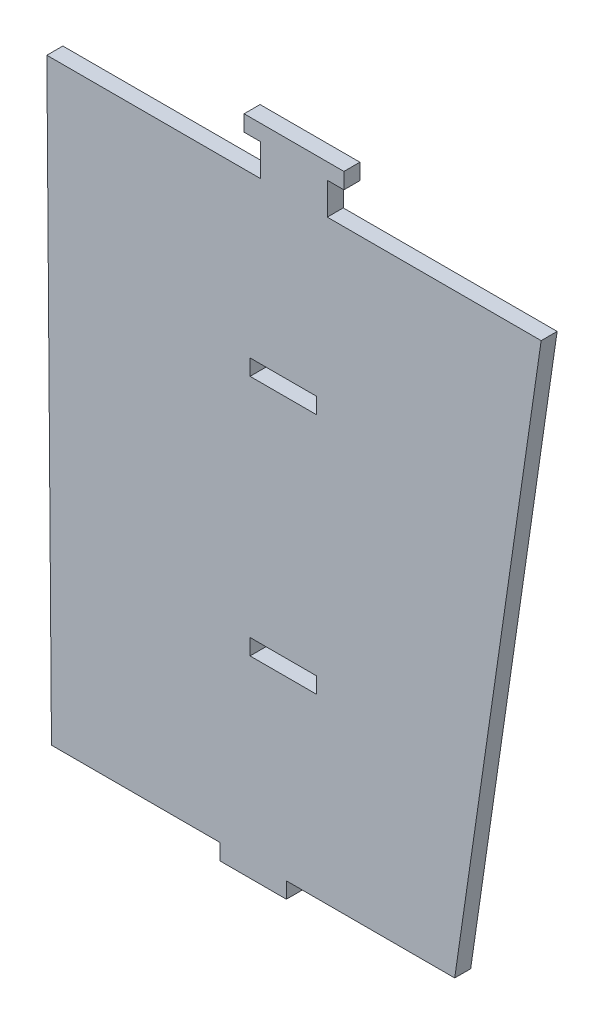
ISO-10303-21;
HEADER;
FILE_DESCRIPTION(('STEP AP214'),'2;1');
FILE_NAME('part.step','',(''),(''),'','','');
FILE_SCHEMA(('AUTOMOTIVE_DESIGN { 1 0 10303 214 1 1 1 1 }'));
ENDSEC;
DATA;
#1=APPLICATION_CONTEXT('core data for automotive mechanical design processes');
#2=APPLICATION_PROTOCOL_DEFINITION('international standard','automotive_design',2000,#1);
#3=PRODUCT_CONTEXT('',#1,'mechanical');
#4=PRODUCT('Part','Part','',(#3));
#5=PRODUCT_RELATED_PRODUCT_CATEGORY('part','',(#4));
#6=PRODUCT_DEFINITION_FORMATION('','',#4);
#7=PRODUCT_DEFINITION_CONTEXT('part definition',#1,'design');
#8=PRODUCT_DEFINITION('design','',#6,#7);
#9=PRODUCT_DEFINITION_SHAPE('','',#8);
#10=(LENGTH_UNIT() NAMED_UNIT(*) SI_UNIT(.MILLI.,.METRE.));
#11=(NAMED_UNIT(*) PLANE_ANGLE_UNIT() SI_UNIT($,.RADIAN.));
#12=(NAMED_UNIT(*) SI_UNIT($,.STERADIAN.) SOLID_ANGLE_UNIT());
#13=UNCERTAINTY_MEASURE_WITH_UNIT(LENGTH_MEASURE(1.E-05),#10,'distance_accuracy_value','');
#14=(GEOMETRIC_REPRESENTATION_CONTEXT(3) GLOBAL_UNCERTAINTY_ASSIGNED_CONTEXT((#13)) GLOBAL_UNIT_ASSIGNED_CONTEXT((#10,
#11,#12)) REPRESENTATION_CONTEXT('',''));
#15=CARTESIAN_POINT('',(0.,0.,0.));
#16=DIRECTION('',(0.,0.,1.));
#17=DIRECTION('',(1.,0.,0.));
#18=AXIS2_PLACEMENT_3D('',#15,#16,#17);
#19=CARTESIAN_POINT('',(-122.883521437337,-1.524,1.524));
#20=DIRECTION('',(0.,-1.,0.));
#21=DIRECTION('',(0.,0.,-1.));
#22=AXIS2_PLACEMENT_3D('',#19,#20,#21);
#23=PLANE('',#22);
#24=DIRECTION('',(-1.,0.,0.));
#25=VECTOR('',#24,1.);
#26=CARTESIAN_POINT('',(-122.883521437337,-1.524,0.));
#27=LINE('',#26,#25);
#28=CARTESIAN_POINT('',(-102.477755774951,-1.524,0.));
#29=VERTEX_POINT('',#28);
#30=CARTESIAN_POINT('',(-122.883521437337,-1.524,0.));
#31=VERTEX_POINT('',#30);
#32=EDGE_CURVE('E260',#29,#31,#27,.T.);
#33=ORIENTED_EDGE('',*,*,#32,.T.);
#34=DIRECTION('',(0.,0.,-1.));
#35=VECTOR('',#34,1.);
#36=CARTESIAN_POINT('',(-122.883521437337,-1.524,1.524));
#37=LINE('',#36,#35);
#38=CARTESIAN_POINT('',(-122.883521437337,-1.524,1.524));
#39=VERTEX_POINT('',#38);
#40=EDGE_CURVE('E11',#39,#31,#37,.T.);
#41=ORIENTED_EDGE('',*,*,#40,.F.);
#42=DIRECTION('',(-1.,0.,0.));
#43=VECTOR('',#42,1.);
#44=CARTESIAN_POINT('',(-122.883521437337,-1.524,1.524));
#45=LINE('',#44,#43);
#46=CARTESIAN_POINT('',(-102.477755774951,-1.524,1.524));
#47=VERTEX_POINT('',#46);
#48=EDGE_CURVE('E267',#47,#39,#45,.T.);
#49=ORIENTED_EDGE('',*,*,#48,.F.);
#50=DIRECTION('',(0.,0.,-1.));
#51=VECTOR('',#50,1.);
#52=CARTESIAN_POINT('',(-102.477755774951,-1.524,1.524));
#53=LINE('',#52,#51);
#54=EDGE_CURVE('E301',#47,#29,#53,.T.);
#55=ORIENTED_EDGE('',*,*,#54,.T.);
#56=EDGE_LOOP('',(#33,#41,#49,#55));
#57=FACE_BOUND('',#56,.T.);
#58=ADVANCED_FACE('F38',(#57),#23,.F.);
#59=CARTESIAN_POINT('',(-122.883521437337,-1.524,1.524));
#60=DIRECTION('',(-1.,0.,0.));
#61=DIRECTION('',(0.,0.,1.));
#62=AXIS2_PLACEMENT_3D('',#59,#60,#61);
#63=PLANE('',#62);
#64=DIRECTION('',(0.,1.,0.));
#65=VECTOR('',#64,1.);
#66=CARTESIAN_POINT('',(-122.883521437337,-1.524,0.));
#67=LINE('',#66,#65);
#68=CARTESIAN_POINT('',(-122.883521437337,1.524,0.));
#69=VERTEX_POINT('',#68);
#70=EDGE_CURVE('E304',#31,#69,#67,.T.);
#71=ORIENTED_EDGE('',*,*,#70,.T.);
#72=DIRECTION('',(0.,0.,-1.));
#73=VECTOR('',#72,1.);
#74=CARTESIAN_POINT('',(-122.883521437337,1.524,1.524));
#75=LINE('',#74,#73);
#76=CARTESIAN_POINT('',(-122.883521437337,1.524,1.524));
#77=VERTEX_POINT('',#76);
#78=EDGE_CURVE('E45',#77,#69,#75,.T.);
#79=ORIENTED_EDGE('',*,*,#78,.F.);
#80=DIRECTION('',(0.,1.,0.));
#81=VECTOR('',#80,1.);
#82=CARTESIAN_POINT('',(-122.883521437337,-1.524,1.524));
#83=LINE('',#82,#81);
#84=EDGE_CURVE('E270',#39,#77,#83,.T.);
#85=ORIENTED_EDGE('',*,*,#84,.F.);
#86=ORIENTED_EDGE('',*,*,#40,.T.);
#87=EDGE_LOOP('',(#71,#79,#85,#86));
#88=FACE_BOUND('',#87,.T.);
#89=ADVANCED_FACE('F400',(#88),#63,.F.);
#90=CARTESIAN_POINT('',(-121.296021437337,1.524,1.524));
#91=DIRECTION('',(0.,1.,0.));
#92=DIRECTION('',(0.,0.,1.));
#93=AXIS2_PLACEMENT_3D('',#90,#91,#92);
#94=PLANE('',#93);
#95=DIRECTION('',(1.,0.,0.));
#96=VECTOR('',#95,1.);
#97=CARTESIAN_POINT('',(-121.296021437337,1.524,0.));
#98=LINE('',#97,#96);
#99=CARTESIAN_POINT('',(-121.296021437337,1.524,0.));
#100=VERTEX_POINT('',#99);
#101=EDGE_CURVE('E306',#69,#100,#98,.T.);
#102=ORIENTED_EDGE('',*,*,#101,.T.);
#103=DIRECTION('',(0.,0.,-1.));
#104=VECTOR('',#103,1.);
#105=CARTESIAN_POINT('',(-121.296021437337,1.524,1.524));
#106=LINE('',#105,#104);
#107=CARTESIAN_POINT('',(-121.296021437337,1.524,1.524));
#108=VERTEX_POINT('',#107);
#109=EDGE_CURVE('E371',#108,#100,#106,.T.);
#110=ORIENTED_EDGE('',*,*,#109,.F.);
#111=DIRECTION('',(1.,0.,0.));
#112=VECTOR('',#111,1.);
#113=CARTESIAN_POINT('',(-121.296021437337,1.524,1.524));
#114=LINE('',#113,#112);
#115=EDGE_CURVE('E273',#77,#108,#114,.T.);
#116=ORIENTED_EDGE('',*,*,#115,.F.);
#117=ORIENTED_EDGE('',*,*,#78,.T.);
#118=EDGE_LOOP('',(#102,#110,#116,#117));
#119=FACE_BOUND('',#118,.T.);
#120=ADVANCED_FACE('F378',(#119),#94,.F.);
#121=CARTESIAN_POINT('',(-121.296021437337,1.524,1.524));
#122=DIRECTION('',(-1.,0.,0.));
#123=DIRECTION('',(0.,0.,1.));
#124=AXIS2_PLACEMENT_3D('',#121,#122,#123);
#125=PLANE('',#124);
#126=DIRECTION('',(0.,1.,0.));
#127=VECTOR('',#126,1.);
#128=CARTESIAN_POINT('',(-121.296021437337,1.524,0.));
#129=LINE('',#128,#127);
#130=CARTESIAN_POINT('',(-121.296021437337,3.048,0.));
#131=VERTEX_POINT('',#130);
#132=EDGE_CURVE('E308',#100,#131,#129,.T.);
#133=ORIENTED_EDGE('',*,*,#132,.T.);
#134=DIRECTION('',(0.,0.,-1.));
#135=VECTOR('',#134,1.);
#136=CARTESIAN_POINT('',(-121.296021437337,3.048,1.524));
#137=LINE('',#136,#135);
#138=CARTESIAN_POINT('',(-121.296021437337,3.048,1.524));
#139=VERTEX_POINT('',#138);
#140=EDGE_CURVE('E368',#139,#131,#137,.T.);
#141=ORIENTED_EDGE('',*,*,#140,.F.);
#142=DIRECTION('',(0.,1.,0.));
#143=VECTOR('',#142,1.);
#144=CARTESIAN_POINT('',(-121.296021437337,1.524,1.524));
#145=LINE('',#144,#143);
#146=EDGE_CURVE('E275',#108,#139,#145,.T.);
#147=ORIENTED_EDGE('',*,*,#146,.F.);
#148=ORIENTED_EDGE('',*,*,#109,.T.);
#149=EDGE_LOOP('',(#133,#141,#147,#148));
#150=FACE_BOUND('',#149,.T.);
#151=ADVANCED_FACE('F388',(#150),#125,.F.);
#152=CARTESIAN_POINT('',(-121.296021437337,3.048,1.524));
#153=DIRECTION('',(0.,-1.,0.));
#154=DIRECTION('',(0.,0.,-1.));
#155=AXIS2_PLACEMENT_3D('',#152,#153,#154);
#156=PLANE('',#155);
#157=DIRECTION('',(-1.,0.,0.));
#158=VECTOR('',#157,1.);
#159=CARTESIAN_POINT('',(-121.296021437337,3.048,0.));
#160=LINE('',#159,#158);
#161=CARTESIAN_POINT('',(-130.821021437337,3.048,0.));
#162=VERTEX_POINT('',#161);
#163=EDGE_CURVE('E310',#131,#162,#160,.T.);
#164=ORIENTED_EDGE('',*,*,#163,.T.);
#165=DIRECTION('',(0.,0.,-1.));
#166=VECTOR('',#165,1.);
#167=CARTESIAN_POINT('',(-130.821021437337,3.048,1.524));
#168=LINE('',#167,#166);
#169=CARTESIAN_POINT('',(-130.821021437337,3.048,1.524));
#170=VERTEX_POINT('',#169);
#171=EDGE_CURVE('E365',#170,#162,#168,.T.);
#172=ORIENTED_EDGE('',*,*,#171,.F.);
#173=DIRECTION('',(-1.,0.,0.));
#174=VECTOR('',#173,1.);
#175=CARTESIAN_POINT('',(-121.296021437337,3.048,1.524));
#176=LINE('',#175,#174);
#177=EDGE_CURVE('E277',#139,#170,#176,.T.);
#178=ORIENTED_EDGE('',*,*,#177,.F.);
#179=ORIENTED_EDGE('',*,*,#140,.T.);
#180=EDGE_LOOP('',(#164,#172,#178,#179));
#181=FACE_BOUND('',#180,.T.);
#182=ADVANCED_FACE('F392',(#181),#156,.F.);
#183=CARTESIAN_POINT('',(-130.821021437337,1.524,1.524));
#184=DIRECTION('',(1.,0.,0.));
#185=DIRECTION('',(0.,0.,-1.));
#186=AXIS2_PLACEMENT_3D('',#183,#184,#185);
#187=PLANE('',#186);
#188=DIRECTION('',(0.,-1.,0.));
#189=VECTOR('',#188,1.);
#190=CARTESIAN_POINT('',(-130.821021437337,1.524,0.));
#191=LINE('',#190,#189);
#192=CARTESIAN_POINT('',(-130.821021437337,1.524,0.));
#193=VERTEX_POINT('',#192);
#194=EDGE_CURVE('E312',#162,#193,#191,.T.);
#195=ORIENTED_EDGE('',*,*,#194,.T.);
#196=DIRECTION('',(0.,0.,-1.));
#197=VECTOR('',#196,1.);
#198=CARTESIAN_POINT('',(-130.821021437337,1.524,1.524));
#199=LINE('',#198,#197);
#200=CARTESIAN_POINT('',(-130.821021437337,1.524,1.524));
#201=VERTEX_POINT('',#200);
#202=EDGE_CURVE('E362',#201,#193,#199,.T.);
#203=ORIENTED_EDGE('',*,*,#202,.F.);
#204=DIRECTION('',(0.,-1.,0.));
#205=VECTOR('',#204,1.);
#206=CARTESIAN_POINT('',(-130.821021437337,1.524,1.524));
#207=LINE('',#206,#205);
#208=EDGE_CURVE('E279',#170,#201,#207,.T.);
#209=ORIENTED_EDGE('',*,*,#208,.F.);
#210=ORIENTED_EDGE('',*,*,#171,.T.);
#211=EDGE_LOOP('',(#195,#203,#209,#210));
#212=FACE_BOUND('',#211,.T.);
#213=ADVANCED_FACE('F453',(#212),#187,.F.);
#214=CARTESIAN_POINT('',(-129.233521437337,1.524,1.524));
#215=DIRECTION('',(0.,1.,0.));
#216=DIRECTION('',(0.,0.,1.));
#217=AXIS2_PLACEMENT_3D('',#214,#215,#216);
#218=PLANE('',#217);
#219=DIRECTION('',(1.,0.,0.));
#220=VECTOR('',#219,1.);
#221=CARTESIAN_POINT('',(-129.233521437337,1.524,0.));
#222=LINE('',#221,#220);
#223=CARTESIAN_POINT('',(-129.233521437337,1.524,0.));
#224=VERTEX_POINT('',#223);
#225=EDGE_CURVE('E314',#193,#224,#222,.T.);
#226=ORIENTED_EDGE('',*,*,#225,.T.);
#227=DIRECTION('',(0.,0.,-1.));
#228=VECTOR('',#227,1.);
#229=CARTESIAN_POINT('',(-129.233521437337,1.524,1.524));
#230=LINE('',#229,#228);
#231=CARTESIAN_POINT('',(-129.233521437337,1.524,1.524));
#232=VERTEX_POINT('',#231);
#233=EDGE_CURVE('E359',#232,#224,#230,.T.);
#234=ORIENTED_EDGE('',*,*,#233,.F.);
#235=DIRECTION('',(1.,0.,0.));
#236=VECTOR('',#235,1.);
#237=CARTESIAN_POINT('',(-129.233521437337,1.524,1.524));
#238=LINE('',#237,#236);
#239=EDGE_CURVE('E281',#201,#232,#238,.T.);
#240=ORIENTED_EDGE('',*,*,#239,.F.);
#241=ORIENTED_EDGE('',*,*,#202,.T.);
#242=EDGE_LOOP('',(#226,#234,#240,#241));
#243=FACE_BOUND('',#242,.T.);
#244=ADVANCED_FACE('F450',(#243),#218,.F.);
#245=CARTESIAN_POINT('',(-129.233521437337,-1.524,1.524));
#246=DIRECTION('',(1.,0.,0.));
#247=DIRECTION('',(0.,0.,-1.));
#248=AXIS2_PLACEMENT_3D('',#245,#246,#247);
#249=PLANE('',#248);
#250=DIRECTION('',(0.,-1.,0.));
#251=VECTOR('',#250,1.);
#252=CARTESIAN_POINT('',(-129.233521437337,-1.524,0.));
#253=LINE('',#252,#251);
#254=CARTESIAN_POINT('',(-129.233521437337,-1.524,0.));
#255=VERTEX_POINT('',#254);
#256=EDGE_CURVE('E316',#224,#255,#253,.T.);
#257=ORIENTED_EDGE('',*,*,#256,.T.);
#258=DIRECTION('',(0.,0.,-1.));
#259=VECTOR('',#258,1.);
#260=CARTESIAN_POINT('',(-129.233521437337,-1.524,1.524));
#261=LINE('',#260,#259);
#262=CARTESIAN_POINT('',(-129.233521437337,-1.524,1.524));
#263=VERTEX_POINT('',#262);
#264=EDGE_CURVE('E356',#263,#255,#261,.T.);
#265=ORIENTED_EDGE('',*,*,#264,.F.);
#266=DIRECTION('',(0.,-1.,0.));
#267=VECTOR('',#266,1.);
#268=CARTESIAN_POINT('',(-129.233521437337,-1.524,1.524));
#269=LINE('',#268,#267);
#270=EDGE_CURVE('E283',#232,#263,#269,.T.);
#271=ORIENTED_EDGE('',*,*,#270,.F.);
#272=ORIENTED_EDGE('',*,*,#233,.T.);
#273=EDGE_LOOP('',(#257,#265,#271,#272));
#274=FACE_BOUND('',#273,.T.);
#275=ADVANCED_FACE('F446',(#274),#249,.F.);
#276=CARTESIAN_POINT('',(-149.639287099722,-1.524,1.524));
#277=DIRECTION('',(0.,-1.,0.));
#278=DIRECTION('',(0.,0.,-1.));
#279=AXIS2_PLACEMENT_3D('',#276,#277,#278);
#280=PLANE('',#279);
#281=DIRECTION('',(-1.,0.,0.));
#282=VECTOR('',#281,1.);
#283=CARTESIAN_POINT('',(-149.639287099722,-1.524,0.));
#284=LINE('',#283,#282);
#285=CARTESIAN_POINT('',(-149.639287099722,-1.524,0.));
#286=VERTEX_POINT('',#285);
#287=EDGE_CURVE('E318',#255,#286,#284,.T.);
#288=ORIENTED_EDGE('',*,*,#287,.T.);
#289=DIRECTION('',(0.,0.,-1.));
#290=VECTOR('',#289,1.);
#291=CARTESIAN_POINT('',(-149.639287099722,-1.524,1.524));
#292=LINE('',#291,#290);
#293=CARTESIAN_POINT('',(-149.639287099722,-1.524,1.524));
#294=VERTEX_POINT('',#293);
#295=EDGE_CURVE('E353',#294,#286,#292,.T.);
#296=ORIENTED_EDGE('',*,*,#295,.F.);
#297=DIRECTION('',(-1.,0.,0.));
#298=VECTOR('',#297,1.);
#299=CARTESIAN_POINT('',(-149.639287099722,-1.524,1.524));
#300=LINE('',#299,#298);
#301=EDGE_CURVE('E285',#263,#294,#300,.T.);
#302=ORIENTED_EDGE('',*,*,#301,.F.);
#303=ORIENTED_EDGE('',*,*,#264,.T.);
#304=EDGE_LOOP('',(#288,#296,#302,#303));
#305=FACE_BOUND('',#304,.T.);
#306=ADVANCED_FACE('F442',(#305),#280,.F.);
#307=CARTESIAN_POINT('',(-149.199401915009,-58.314338925609,1.524));
#308=DIRECTION('',(0.999970002835002,0.00774554259978691,0.));
#309=DIRECTION('',(-0.00774554259978691,0.999970002835003,0.));
#310=AXIS2_PLACEMENT_3D('',#307,#308,#309);
#311=PLANE('',#310);
#312=DIRECTION('',(0.00774554259978691,-0.999970002835002,0.));
#313=VECTOR('',#312,1.);
#314=CARTESIAN_POINT('',(-149.199401915009,-58.314338925609,0.));
#315=LINE('',#314,#313);
#316=CARTESIAN_POINT('',(-149.199401915009,-58.314338925609,0.));
#317=VERTEX_POINT('',#316);
#318=EDGE_CURVE('E320',#286,#317,#315,.T.);
#319=ORIENTED_EDGE('',*,*,#318,.T.);
#320=DIRECTION('',(0.,0.,-1.));
#321=VECTOR('',#320,1.);
#322=CARTESIAN_POINT('',(-149.199401915009,-58.314338925609,1.524));
#323=LINE('',#322,#321);
#324=CARTESIAN_POINT('',(-149.199401915009,-58.314338925609,1.524));
#325=VERTEX_POINT('',#324);
#326=EDGE_CURVE('E350',#325,#317,#323,.T.);
#327=ORIENTED_EDGE('',*,*,#326,.F.);
#328=DIRECTION('',(0.00774554259978691,-0.999970002835002,0.));
#329=VECTOR('',#328,1.);
#330=CARTESIAN_POINT('',(-149.199401915009,-58.314338925609,1.524));
#331=LINE('',#330,#329);
#332=EDGE_CURVE('E287',#294,#325,#331,.T.);
#333=ORIENTED_EDGE('',*,*,#332,.F.);
#334=ORIENTED_EDGE('',*,*,#295,.T.);
#335=EDGE_LOOP('',(#319,#327,#333,#334));
#336=FACE_BOUND('',#335,.T.);
#337=ADVANCED_FACE('F437',(#336),#311,.F.);
#338=CARTESIAN_POINT('',(-133.13789889878,-58.314338925609,1.524));
#339=DIRECTION('',(0.,1.,0.));
#340=DIRECTION('',(-1.,0.,0.));
#341=AXIS2_PLACEMENT_3D('',#338,#339,#340);
#342=PLANE('',#341);
#343=DIRECTION('',(1.,0.,0.));
#344=VECTOR('',#343,1.);
#345=CARTESIAN_POINT('',(-133.13789889878,-58.314338925609,0.));
#346=LINE('',#345,#344);
#347=CARTESIAN_POINT('',(-133.13789889878,-58.314338925609,0.));
#348=VERTEX_POINT('',#347);
#349=EDGE_CURVE('E322',#317,#348,#346,.T.);
#350=ORIENTED_EDGE('',*,*,#349,.T.);
#351=DIRECTION('',(0.,0.,-1.));
#352=VECTOR('',#351,1.);
#353=CARTESIAN_POINT('',(-133.13789889878,-58.314338925609,1.524));
#354=LINE('',#353,#352);
#355=CARTESIAN_POINT('',(-133.13789889878,-58.314338925609,1.524));
#356=VERTEX_POINT('',#355);
#357=EDGE_CURVE('E347',#356,#348,#354,.T.);
#358=ORIENTED_EDGE('',*,*,#357,.F.);
#359=DIRECTION('',(1.,0.,0.));
#360=VECTOR('',#359,1.);
#361=CARTESIAN_POINT('',(-133.13789889878,-58.314338925609,1.524));
#362=LINE('',#361,#360);
#363=EDGE_CURVE('E289',#325,#356,#362,.T.);
#364=ORIENTED_EDGE('',*,*,#363,.F.);
#365=ORIENTED_EDGE('',*,*,#326,.T.);
#366=EDGE_LOOP('',(#350,#358,#364,#365));
#367=FACE_BOUND('',#366,.T.);
#368=ADVANCED_FACE('F431',(#367),#342,.F.);
#369=CARTESIAN_POINT('',(-133.13789889878,-58.314338925609,1.524));
#370=DIRECTION('',(1.,0.,0.));
#371=DIRECTION('',(0.,0.,-1.));
#372=AXIS2_PLACEMENT_3D('',#369,#370,#371);
#373=PLANE('',#372);
#374=DIRECTION('',(0.,-1.,0.));
#375=VECTOR('',#374,1.);
#376=CARTESIAN_POINT('',(-133.13789889878,-58.314338925609,0.));
#377=LINE('',#376,#375);
#378=CARTESIAN_POINT('',(-133.13789889878,-59.838338925609,0.));
#379=VERTEX_POINT('',#378);
#380=EDGE_CURVE('E324',#348,#379,#377,.T.);
#381=ORIENTED_EDGE('',*,*,#380,.T.);
#382=DIRECTION('',(0.,0.,-1.));
#383=VECTOR('',#382,1.);
#384=CARTESIAN_POINT('',(-133.13789889878,-59.838338925609,1.524));
#385=LINE('',#384,#383);
#386=CARTESIAN_POINT('',(-133.13789889878,-59.838338925609,1.524));
#387=VERTEX_POINT('',#386);
#388=EDGE_CURVE('E344',#387,#379,#385,.T.);
#389=ORIENTED_EDGE('',*,*,#388,.F.);
#390=DIRECTION('',(0.,-1.,0.));
#391=VECTOR('',#390,1.);
#392=CARTESIAN_POINT('',(-133.13789889878,-58.314338925609,1.524));
#393=LINE('',#392,#391);
#394=EDGE_CURVE('E291',#356,#387,#393,.T.);
#395=ORIENTED_EDGE('',*,*,#394,.F.);
#396=ORIENTED_EDGE('',*,*,#357,.T.);
#397=EDGE_LOOP('',(#381,#389,#395,#396));
#398=FACE_BOUND('',#397,.T.);
#399=ADVANCED_FACE('F427',(#398),#373,.F.);
#400=CARTESIAN_POINT('',(-133.13789889878,-59.838338925609,1.524));
#401=DIRECTION('',(0.,1.,0.));
#402=DIRECTION('',(0.,0.,1.));
#403=AXIS2_PLACEMENT_3D('',#400,#401,#402);
#404=PLANE('',#403);
#405=DIRECTION('',(1.,0.,0.));
#406=VECTOR('',#405,1.);
#407=CARTESIAN_POINT('',(-133.13789889878,-59.838338925609,0.));
#408=LINE('',#407,#406);
#409=CARTESIAN_POINT('',(-126.78789889878,-59.838338925609,0.));
#410=VERTEX_POINT('',#409);
#411=EDGE_CURVE('E326',#379,#410,#408,.T.);
#412=ORIENTED_EDGE('',*,*,#411,.T.);
#413=DIRECTION('',(0.,0.,-1.));
#414=VECTOR('',#413,1.);
#415=CARTESIAN_POINT('',(-126.78789889878,-59.838338925609,1.524));
#416=LINE('',#415,#414);
#417=CARTESIAN_POINT('',(-126.78789889878,-59.838338925609,1.524));
#418=VERTEX_POINT('',#417);
#419=EDGE_CURVE('E341',#418,#410,#416,.T.);
#420=ORIENTED_EDGE('',*,*,#419,.F.);
#421=DIRECTION('',(1.,0.,0.));
#422=VECTOR('',#421,1.);
#423=CARTESIAN_POINT('',(-133.13789889878,-59.838338925609,1.524));
#424=LINE('',#423,#422);
#425=EDGE_CURVE('E293',#387,#418,#424,.T.);
#426=ORIENTED_EDGE('',*,*,#425,.F.);
#427=ORIENTED_EDGE('',*,*,#388,.T.);
#428=EDGE_LOOP('',(#412,#420,#426,#427));
#429=FACE_BOUND('',#428,.T.);
#430=ADVANCED_FACE('F422',(#429),#404,.F.);
#431=CARTESIAN_POINT('',(-126.78789889878,-58.314338925609,1.524));
#432=DIRECTION('',(-1.,0.,0.));
#433=DIRECTION('',(0.,0.,1.));
#434=AXIS2_PLACEMENT_3D('',#431,#432,#433);
#435=PLANE('',#434);
#436=DIRECTION('',(0.,1.,0.));
#437=VECTOR('',#436,1.);
#438=CARTESIAN_POINT('',(-126.78789889878,-58.314338925609,0.));
#439=LINE('',#438,#437);
#440=CARTESIAN_POINT('',(-126.78789889878,-58.314338925609,0.));
#441=VERTEX_POINT('',#440);
#442=EDGE_CURVE('E328',#410,#441,#439,.T.);
#443=ORIENTED_EDGE('',*,*,#442,.T.);
#444=DIRECTION('',(0.,0.,-1.));
#445=VECTOR('',#444,1.);
#446=CARTESIAN_POINT('',(-126.78789889878,-58.314338925609,1.524));
#447=LINE('',#446,#445);
#448=CARTESIAN_POINT('',(-126.78789889878,-58.314338925609,1.524));
#449=VERTEX_POINT('',#448);
#450=EDGE_CURVE('E338',#449,#441,#447,.T.);
#451=ORIENTED_EDGE('',*,*,#450,.F.);
#452=DIRECTION('',(0.,1.,0.));
#453=VECTOR('',#452,1.);
#454=CARTESIAN_POINT('',(-126.78789889878,-58.314338925609,1.524));
#455=LINE('',#454,#453);
#456=EDGE_CURVE('E295',#418,#449,#455,.T.);
#457=ORIENTED_EDGE('',*,*,#456,.F.);
#458=ORIENTED_EDGE('',*,*,#419,.T.);
#459=EDGE_LOOP('',(#443,#451,#457,#458));
#460=FACE_BOUND('',#459,.T.);
#461=ADVANCED_FACE('F416',(#460),#435,.F.);
#462=CARTESIAN_POINT('',(-110.726395882551,-58.314338925609,1.524));
#463=DIRECTION('',(0.,1.,0.));
#464=DIRECTION('',(0.,0.,1.));
#465=AXIS2_PLACEMENT_3D('',#462,#463,#464);
#466=PLANE('',#465);
#467=DIRECTION('',(1.,0.,0.));
#468=VECTOR('',#467,1.);
#469=CARTESIAN_POINT('',(-110.726395882551,-58.314338925609,0.));
#470=LINE('',#469,#468);
#471=CARTESIAN_POINT('',(-110.726395882551,-58.314338925609,0.));
#472=VERTEX_POINT('',#471);
#473=EDGE_CURVE('E330',#441,#472,#470,.T.);
#474=ORIENTED_EDGE('',*,*,#473,.T.);
#475=DIRECTION('',(0.,0.,-1.));
#476=VECTOR('',#475,1.);
#477=CARTESIAN_POINT('',(-110.726395882551,-58.314338925609,1.524));
#478=LINE('',#477,#476);
#479=CARTESIAN_POINT('',(-110.726395882551,-58.314338925609,1.524));
#480=VERTEX_POINT('',#479);
#481=EDGE_CURVE('E335',#480,#472,#478,.T.);
#482=ORIENTED_EDGE('',*,*,#481,.F.);
#483=DIRECTION('',(1.,0.,0.));
#484=VECTOR('',#483,1.);
#485=CARTESIAN_POINT('',(-110.726395882551,-58.314338925609,1.524));
#486=LINE('',#485,#484);
#487=EDGE_CURVE('E297',#449,#480,#486,.T.);
#488=ORIENTED_EDGE('',*,*,#487,.F.);
#489=ORIENTED_EDGE('',*,*,#450,.T.);
#490=EDGE_LOOP('',(#474,#482,#488,#489));
#491=FACE_BOUND('',#490,.T.);
#492=ADVANCED_FACE('F412',(#491),#466,.F.);
#493=CARTESIAN_POINT('',(-102.477755774951,-1.524,1.524));
#494=DIRECTION('',(-0.98961564073596,0.143738942568655,0.));
#495=DIRECTION('',(-0.143738942568655,-0.98961564073596,0.));
#496=AXIS2_PLACEMENT_3D('',#493,#494,#495);
#497=PLANE('',#496);
#498=DIRECTION('',(0.143738942568655,0.98961564073596,0.));
#499=VECTOR('',#498,1.);
#500=CARTESIAN_POINT('',(-102.477755774951,-1.524,0.));
#501=LINE('',#500,#499);
#502=EDGE_CURVE('E271',#472,#29,#501,.T.);
#503=ORIENTED_EDGE('',*,*,#502,.T.);
#504=ORIENTED_EDGE('',*,*,#54,.F.);
#505=DIRECTION('',(0.143738942568655,0.98961564073596,0.));
#506=VECTOR('',#505,1.);
#507=CARTESIAN_POINT('',(-102.477755774951,-1.524,1.524));
#508=LINE('',#507,#506);
#509=EDGE_CURVE('E299',#480,#47,#508,.T.);
#510=ORIENTED_EDGE('',*,*,#509,.F.);
#511=ORIENTED_EDGE('',*,*,#481,.T.);
#512=EDGE_LOOP('',(#503,#504,#510,#511));
#513=FACE_BOUND('',#512,.T.);
#514=ADVANCED_FACE('F407',(#513),#497,.F.);
#515=CARTESIAN_POINT('',(0.,0.,1.524));
#516=DIRECTION('',(0.,0.,-1.));
#517=DIRECTION('',(-1.,0.,0.));
#518=AXIS2_PLACEMENT_3D('',#515,#516,#517);
#519=PLANE('',#518);
#520=DIRECTION('',(1.,0.,0.));
#521=VECTOR('',#520,1.);
#522=CARTESIAN_POINT('',(-130.253752717354,-41.4650473772707,1.524));
#523=LINE('',#522,#521);
#524=CARTESIAN_POINT('',(-130.253752717354,-41.4650473772707,1.524));
#525=VERTEX_POINT('',#524);
#526=CARTESIAN_POINT('',(-123.903752717354,-41.4650473772707,1.524));
#527=VERTEX_POINT('',#526);
#528=EDGE_CURVE('E225',#525,#527,#523,.T.);
#529=ORIENTED_EDGE('',*,*,#528,.F.);
#530=DIRECTION('',(0.,-1.,0.));
#531=VECTOR('',#530,1.);
#532=CARTESIAN_POINT('',(-130.253752717354,-39.9410473772707,1.524));
#533=LINE('',#532,#531);
#534=CARTESIAN_POINT('',(-130.253752717354,-39.9410473772707,1.524));
#535=VERTEX_POINT('',#534);
#536=EDGE_CURVE('E52',#535,#525,#533,.T.);
#537=ORIENTED_EDGE('',*,*,#536,.F.);
#538=DIRECTION('',(-1.,0.,0.));
#539=VECTOR('',#538,1.);
#540=CARTESIAN_POINT('',(-130.253752717354,-39.9410473772707,1.524));
#541=LINE('',#540,#539);
#542=CARTESIAN_POINT('',(-123.903752717354,-39.9410473772707,1.524));
#543=VERTEX_POINT('',#542);
#544=EDGE_CURVE('E216',#543,#535,#541,.T.);
#545=ORIENTED_EDGE('',*,*,#544,.F.);
#546=DIRECTION('',(0.,1.,0.));
#547=VECTOR('',#546,1.);
#548=CARTESIAN_POINT('',(-123.903752717354,-39.9410473772707,1.524));
#549=LINE('',#548,#547);
#550=EDGE_CURVE('E219',#527,#543,#549,.T.);
#551=ORIENTED_EDGE('',*,*,#550,.F.);
#552=EDGE_LOOP('',(#529,#537,#545,#551));
#553=FACE_BOUND('',#552,.T.);
#554=DIRECTION('',(0.,-1.,0.));
#555=VECTOR('',#554,1.);
#556=CARTESIAN_POINT('',(-130.253752717354,-16.8400113119809,1.524));
#557=LINE('',#556,#555);
#558=CARTESIAN_POINT('',(-130.253752717354,-16.8400113119809,1.524));
#559=VERTEX_POINT('',#558);
#560=CARTESIAN_POINT('',(-130.253752717354,-18.3640113119809,1.524));
#561=VERTEX_POINT('',#560);
#562=EDGE_CURVE('E250',#559,#561,#557,.T.);
#563=ORIENTED_EDGE('',*,*,#562,.F.);
#564=DIRECTION('',(-1.,0.,0.));
#565=VECTOR('',#564,1.);
#566=CARTESIAN_POINT('',(-130.253752717354,-16.8400113119809,1.524));
#567=LINE('',#566,#565);
#568=CARTESIAN_POINT('',(-123.903752717354,-16.8400113119809,1.524));
#569=VERTEX_POINT('',#568);
#570=EDGE_CURVE('E231',#569,#559,#567,.T.);
#571=ORIENTED_EDGE('',*,*,#570,.F.);
#572=DIRECTION('',(0.,1.,0.));
#573=VECTOR('',#572,1.);
#574=CARTESIAN_POINT('',(-123.903752717354,-16.8400113119809,1.524));
#575=LINE('',#574,#573);
#576=CARTESIAN_POINT('',(-123.903752717354,-18.3640113119809,1.524));
#577=VERTEX_POINT('',#576);
#578=EDGE_CURVE('E239',#577,#569,#575,.T.);
#579=ORIENTED_EDGE('',*,*,#578,.F.);
#580=DIRECTION('',(1.,0.,0.));
#581=VECTOR('',#580,1.);
#582=CARTESIAN_POINT('',(-130.253752717354,-18.3640113119809,1.524));
#583=LINE('',#582,#581);
#584=EDGE_CURVE('E253',#561,#577,#583,.T.);
#585=ORIENTED_EDGE('',*,*,#584,.F.);
#586=EDGE_LOOP('',(#563,#571,#579,#585));
#587=FACE_BOUND('',#586,.T.);
#588=ORIENTED_EDGE('',*,*,#48,.T.);
#589=ORIENTED_EDGE('',*,*,#84,.T.);
#590=ORIENTED_EDGE('',*,*,#115,.T.);
#591=ORIENTED_EDGE('',*,*,#146,.T.);
#592=ORIENTED_EDGE('',*,*,#177,.T.);
#593=ORIENTED_EDGE('',*,*,#208,.T.);
#594=ORIENTED_EDGE('',*,*,#239,.T.);
#595=ORIENTED_EDGE('',*,*,#270,.T.);
#596=ORIENTED_EDGE('',*,*,#301,.T.);
#597=ORIENTED_EDGE('',*,*,#332,.T.);
#598=ORIENTED_EDGE('',*,*,#363,.T.);
#599=ORIENTED_EDGE('',*,*,#394,.T.);
#600=ORIENTED_EDGE('',*,*,#425,.T.);
#601=ORIENTED_EDGE('',*,*,#456,.T.);
#602=ORIENTED_EDGE('',*,*,#487,.T.);
#603=ORIENTED_EDGE('',*,*,#509,.T.);
#604=EDGE_LOOP('',(#588,#589,#590,#591,#592,#593,#594,#595,#596,#597,#598,#599,#600,#601,#602,#603));
#605=FACE_BOUND('',#604,.T.);
#606=ADVANCED_FACE('F396',(#553,#587,#605),#519,.F.);
#607=CARTESIAN_POINT('',(0.,0.,0.));
#608=DIRECTION('',(0.,0.,-1.));
#609=DIRECTION('',(-1.,0.,0.));
#610=AXIS2_PLACEMENT_3D('',#607,#608,#609);
#611=PLANE('',#610);
#612=DIRECTION('',(0.,-1.,0.));
#613=VECTOR('',#612,1.);
#614=CARTESIAN_POINT('',(-130.253752717354,-39.9410473772707,0.));
#615=LINE('',#614,#613);
#616=CARTESIAN_POINT('',(-130.253752717354,-39.9410473772707,0.));
#617=VERTEX_POINT('',#616);
#618=CARTESIAN_POINT('',(-130.253752717354,-41.4650473772707,0.));
#619=VERTEX_POINT('',#618);
#620=EDGE_CURVE('E200',#617,#619,#615,.T.);
#621=ORIENTED_EDGE('',*,*,#620,.T.);
#622=DIRECTION('',(1.,0.,0.));
#623=VECTOR('',#622,1.);
#624=CARTESIAN_POINT('',(-130.253752717354,-41.4650473772707,0.));
#625=LINE('',#624,#623);
#626=CARTESIAN_POINT('',(-123.903752717354,-41.4650473772707,0.));
#627=VERTEX_POINT('',#626);
#628=EDGE_CURVE('E209',#619,#627,#625,.T.);
#629=ORIENTED_EDGE('',*,*,#628,.T.);
#630=DIRECTION('',(0.,1.,0.));
#631=VECTOR('',#630,1.);
#632=CARTESIAN_POINT('',(-123.903752717354,-39.9410473772707,0.));
#633=LINE('',#632,#631);
#634=CARTESIAN_POINT('',(-123.903752717354,-39.9410473772707,0.));
#635=VERTEX_POINT('',#634);
#636=EDGE_CURVE('E60',#627,#635,#633,.T.);
#637=ORIENTED_EDGE('',*,*,#636,.T.);
#638=DIRECTION('',(-1.,0.,0.));
#639=VECTOR('',#638,1.);
#640=CARTESIAN_POINT('',(-130.253752717354,-39.9410473772707,0.));
#641=LINE('',#640,#639);
#642=EDGE_CURVE('E206',#635,#617,#641,.T.);
#643=ORIENTED_EDGE('',*,*,#642,.T.);
#644=EDGE_LOOP('',(#621,#629,#637,#643));
#645=FACE_BOUND('',#644,.T.);
#646=DIRECTION('',(-1.,0.,0.));
#647=VECTOR('',#646,1.);
#648=CARTESIAN_POINT('',(-130.253752717354,-16.8400113119809,0.));
#649=LINE('',#648,#647);
#650=CARTESIAN_POINT('',(-123.903752717354,-16.8400113119809,0.));
#651=VERTEX_POINT('',#650);
#652=CARTESIAN_POINT('',(-130.253752717354,-16.8400113119809,0.));
#653=VERTEX_POINT('',#652);
#654=EDGE_CURVE('E235',#651,#653,#649,.T.);
#655=ORIENTED_EDGE('',*,*,#654,.T.);
#656=DIRECTION('',(0.,-1.,0.));
#657=VECTOR('',#656,1.);
#658=CARTESIAN_POINT('',(-130.253752717354,-16.8400113119809,0.));
#659=LINE('',#658,#657);
#660=CARTESIAN_POINT('',(-130.253752717354,-18.3640113119809,0.));
#661=VERTEX_POINT('',#660);
#662=EDGE_CURVE('E238',#653,#661,#659,.T.);
#663=ORIENTED_EDGE('',*,*,#662,.T.);
#664=DIRECTION('',(1.,0.,0.));
#665=VECTOR('',#664,1.);
#666=CARTESIAN_POINT('',(-130.253752717354,-18.3640113119809,0.));
#667=LINE('',#666,#665);
#668=CARTESIAN_POINT('',(-123.903752717354,-18.3640113119809,0.));
#669=VERTEX_POINT('',#668);
#670=EDGE_CURVE('E242',#661,#669,#667,.T.);
#671=ORIENTED_EDGE('',*,*,#670,.T.);
#672=DIRECTION('',(0.,1.,0.));
#673=VECTOR('',#672,1.);
#674=CARTESIAN_POINT('',(-123.903752717354,-16.8400113119809,0.));
#675=LINE('',#674,#673);
#676=EDGE_CURVE('E245',#669,#651,#675,.T.);
#677=ORIENTED_EDGE('',*,*,#676,.T.);
#678=EDGE_LOOP('',(#655,#663,#671,#677));
#679=FACE_BOUND('',#678,.T.);
#680=ORIENTED_EDGE('',*,*,#32,.F.);
#681=ORIENTED_EDGE('',*,*,#502,.F.);
#682=ORIENTED_EDGE('',*,*,#473,.F.);
#683=ORIENTED_EDGE('',*,*,#442,.F.);
#684=ORIENTED_EDGE('',*,*,#411,.F.);
#685=ORIENTED_EDGE('',*,*,#380,.F.);
#686=ORIENTED_EDGE('',*,*,#349,.F.);
#687=ORIENTED_EDGE('',*,*,#318,.F.);
#688=ORIENTED_EDGE('',*,*,#287,.F.);
#689=ORIENTED_EDGE('',*,*,#256,.F.);
#690=ORIENTED_EDGE('',*,*,#225,.F.);
#691=ORIENTED_EDGE('',*,*,#194,.F.);
#692=ORIENTED_EDGE('',*,*,#163,.F.);
#693=ORIENTED_EDGE('',*,*,#132,.F.);
#694=ORIENTED_EDGE('',*,*,#101,.F.);
#695=ORIENTED_EDGE('',*,*,#70,.F.);
#696=EDGE_LOOP('',(#680,#681,#682,#683,#684,#685,#686,#687,#688,#689,#690,#691,#692,#693,#694,#695));
#697=FACE_BOUND('',#696,.T.);
#698=ADVANCED_FACE('F213',(#645,#679,#697),#611,.T.);
#699=CARTESIAN_POINT('',(-130.253752717354,-16.8400113119809,0.));
#700=DIRECTION('',(0.,1.,0.));
#701=DIRECTION('',(0.,0.,1.));
#702=AXIS2_PLACEMENT_3D('',#699,#700,#701);
#703=PLANE('',#702);
#704=ORIENTED_EDGE('',*,*,#570,.T.);
#705=DIRECTION('',(0.,0.,1.));
#706=VECTOR('',#705,1.);
#707=CARTESIAN_POINT('',(-130.253752717354,-16.8400113119809,0.));
#708=LINE('',#707,#706);
#709=EDGE_CURVE('E248',#653,#559,#708,.T.);
#710=ORIENTED_EDGE('',*,*,#709,.F.);
#711=ORIENTED_EDGE('',*,*,#654,.F.);
#712=DIRECTION('',(0.,0.,1.));
#713=VECTOR('',#712,1.);
#714=CARTESIAN_POINT('',(-123.903752717354,-16.8400113119809,0.));
#715=LINE('',#714,#713);
#716=EDGE_CURVE('E258',#651,#569,#715,.T.);
#717=ORIENTED_EDGE('',*,*,#716,.T.);
#718=EDGE_LOOP('',(#704,#710,#711,#717));
#719=FACE_BOUND('',#718,.T.);
#720=ADVANCED_FACE('F580',(#719),#703,.F.);
#721=CARTESIAN_POINT('',(-123.903752717354,-16.8400113119809,0.));
#722=DIRECTION('',(1.,0.,0.));
#723=DIRECTION('',(0.,0.,-1.));
#724=AXIS2_PLACEMENT_3D('',#721,#722,#723);
#725=PLANE('',#724);
#726=ORIENTED_EDGE('',*,*,#578,.T.);
#727=ORIENTED_EDGE('',*,*,#716,.F.);
#728=ORIENTED_EDGE('',*,*,#676,.F.);
#729=DIRECTION('',(0.,0.,1.));
#730=VECTOR('',#729,1.);
#731=CARTESIAN_POINT('',(-123.903752717354,-18.3640113119809,0.));
#732=LINE('',#731,#730);
#733=EDGE_CURVE('E261',#669,#577,#732,.T.);
#734=ORIENTED_EDGE('',*,*,#733,.T.);
#735=EDGE_LOOP('',(#726,#727,#728,#734));
#736=FACE_BOUND('',#735,.T.);
#737=ADVANCED_FACE('F589',(#736),#725,.F.);
#738=CARTESIAN_POINT('',(-130.253752717354,-18.3640113119809,0.));
#739=DIRECTION('',(0.,-1.,0.));
#740=DIRECTION('',(0.,0.,-1.));
#741=AXIS2_PLACEMENT_3D('',#738,#739,#740);
#742=PLANE('',#741);
#743=ORIENTED_EDGE('',*,*,#584,.T.);
#744=ORIENTED_EDGE('',*,*,#733,.F.);
#745=ORIENTED_EDGE('',*,*,#670,.F.);
#746=DIRECTION('',(0.,0.,1.));
#747=VECTOR('',#746,1.);
#748=CARTESIAN_POINT('',(-130.253752717354,-18.3640113119809,0.));
#749=LINE('',#748,#747);
#750=EDGE_CURVE('E263',#661,#561,#749,.T.);
#751=ORIENTED_EDGE('',*,*,#750,.T.);
#752=EDGE_LOOP('',(#743,#744,#745,#751));
#753=FACE_BOUND('',#752,.T.);
#754=ADVANCED_FACE('F599',(#753),#742,.F.);
#755=CARTESIAN_POINT('',(-130.253752717354,-16.8400113119809,0.));
#756=DIRECTION('',(-1.,0.,0.));
#757=DIRECTION('',(0.,0.,1.));
#758=AXIS2_PLACEMENT_3D('',#755,#756,#757);
#759=PLANE('',#758);
#760=ORIENTED_EDGE('',*,*,#562,.T.);
#761=ORIENTED_EDGE('',*,*,#750,.F.);
#762=ORIENTED_EDGE('',*,*,#662,.F.);
#763=ORIENTED_EDGE('',*,*,#709,.T.);
#764=EDGE_LOOP('',(#760,#761,#762,#763));
#765=FACE_BOUND('',#764,.T.);
#766=ADVANCED_FACE('F609',(#765),#759,.F.);
#767=CARTESIAN_POINT('',(-130.253752717354,-39.9410473772707,0.));
#768=DIRECTION('',(-1.,0.,0.));
#769=DIRECTION('',(0.,0.,1.));
#770=AXIS2_PLACEMENT_3D('',#767,#768,#769);
#771=PLANE('',#770);
#772=ORIENTED_EDGE('',*,*,#536,.T.);
#773=DIRECTION('',(0.,0.,1.));
#774=VECTOR('',#773,1.);
#775=CARTESIAN_POINT('',(-130.253752717354,-41.4650473772707,0.));
#776=LINE('',#775,#774);
#777=EDGE_CURVE('E196',#619,#525,#776,.T.);
#778=ORIENTED_EDGE('',*,*,#777,.F.);
#779=ORIENTED_EDGE('',*,*,#620,.F.);
#780=DIRECTION('',(0.,0.,1.));
#781=VECTOR('',#780,1.);
#782=CARTESIAN_POINT('',(-130.253752717354,-39.9410473772707,0.));
#783=LINE('',#782,#781);
#784=EDGE_CURVE('E229',#617,#535,#783,.T.);
#785=ORIENTED_EDGE('',*,*,#784,.T.);
#786=EDGE_LOOP('',(#772,#778,#779,#785));
#787=FACE_BOUND('',#786,.T.);
#788=ADVANCED_FACE('F198',(#787),#771,.F.);
#789=CARTESIAN_POINT('',(-130.253752717354,-39.9410473772707,0.));
#790=DIRECTION('',(0.,1.,0.));
#791=DIRECTION('',(0.,0.,1.));
#792=AXIS2_PLACEMENT_3D('',#789,#790,#791);
#793=PLANE('',#792);
#794=ORIENTED_EDGE('',*,*,#544,.T.);
#795=ORIENTED_EDGE('',*,*,#784,.F.);
#796=ORIENTED_EDGE('',*,*,#642,.F.);
#797=DIRECTION('',(0.,0.,1.));
#798=VECTOR('',#797,1.);
#799=CARTESIAN_POINT('',(-123.903752717354,-39.9410473772707,0.));
#800=LINE('',#799,#798);
#801=EDGE_CURVE('E232',#635,#543,#800,.T.);
#802=ORIENTED_EDGE('',*,*,#801,.T.);
#803=EDGE_LOOP('',(#794,#795,#796,#802));
#804=FACE_BOUND('',#803,.T.);
#805=ADVANCED_FACE('F628',(#804),#793,.F.);
#806=CARTESIAN_POINT('',(-123.903752717354,-39.9410473772707,0.));
#807=DIRECTION('',(1.,0.,0.));
#808=DIRECTION('',(0.,0.,-1.));
#809=AXIS2_PLACEMENT_3D('',#806,#807,#808);
#810=PLANE('',#809);
#811=ORIENTED_EDGE('',*,*,#550,.T.);
#812=ORIENTED_EDGE('',*,*,#801,.F.);
#813=ORIENTED_EDGE('',*,*,#636,.F.);
#814=DIRECTION('',(0.,0.,1.));
#815=VECTOR('',#814,1.);
#816=CARTESIAN_POINT('',(-123.903752717354,-41.4650473772707,0.));
#817=LINE('',#816,#815);
#818=EDGE_CURVE('E205',#627,#527,#817,.T.);
#819=ORIENTED_EDGE('',*,*,#818,.T.);
#820=EDGE_LOOP('',(#811,#812,#813,#819));
#821=FACE_BOUND('',#820,.T.);
#822=ADVANCED_FACE('F637',(#821),#810,.F.);
#823=CARTESIAN_POINT('',(-130.253752717354,-41.4650473772707,0.));
#824=DIRECTION('',(0.,-1.,0.));
#825=DIRECTION('',(0.,0.,-1.));
#826=AXIS2_PLACEMENT_3D('',#823,#824,#825);
#827=PLANE('',#826);
#828=ORIENTED_EDGE('',*,*,#528,.T.);
#829=ORIENTED_EDGE('',*,*,#818,.F.);
#830=ORIENTED_EDGE('',*,*,#628,.F.);
#831=ORIENTED_EDGE('',*,*,#777,.T.);
#832=EDGE_LOOP('',(#828,#829,#830,#831));
#833=FACE_BOUND('',#832,.T.);
#834=ADVANCED_FACE('F210',(#833),#827,.F.);
#835=CLOSED_SHELL('',(#58,#89,#120,#151,#182,#213,#244,#275,#306,#337,#368,#399,#430,#461,#492,
#514,#606,#698,#720,#737,#754,#766,#788,#805,#822,#834));
#836=MANIFOLD_SOLID_BREP('B2',#835);
#837=ADVANCED_BREP_SHAPE_REPRESENTATION('',(#18,#836),#14);
#838=SHAPE_DEFINITION_REPRESENTATION(#9,#837);
ENDSEC;
END-ISO-10303-21;
